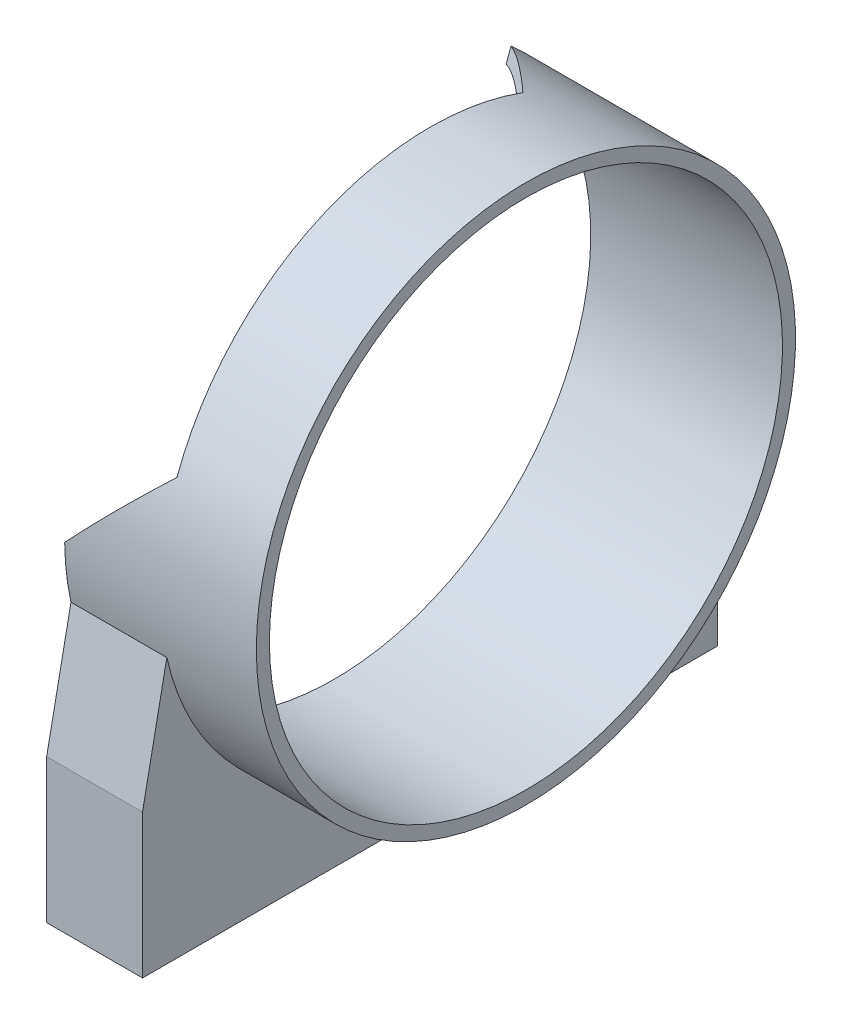
ISO-10303-21;
HEADER;
FILE_DESCRIPTION(('STEP AP214'),'2;1');
FILE_NAME('part.step','',(''),(''),'','','');
FILE_SCHEMA(('AUTOMOTIVE_DESIGN { 1 0 10303 214 1 1 1 1 }'));
ENDSEC;
DATA;
#1=APPLICATION_CONTEXT('core data for automotive mechanical design processes');
#2=APPLICATION_PROTOCOL_DEFINITION('international standard','automotive_design',2000,#1);
#3=PRODUCT_CONTEXT('',#1,'mechanical');
#4=PRODUCT('Part','Part','',(#3));
#5=PRODUCT_RELATED_PRODUCT_CATEGORY('part','',(#4));
#6=PRODUCT_DEFINITION_FORMATION('','',#4);
#7=PRODUCT_DEFINITION_CONTEXT('part definition',#1,'design');
#8=PRODUCT_DEFINITION('design','',#6,#7);
#9=PRODUCT_DEFINITION_SHAPE('','',#8);
#10=(LENGTH_UNIT() NAMED_UNIT(*) SI_UNIT(.MILLI.,.METRE.));
#11=(NAMED_UNIT(*) PLANE_ANGLE_UNIT() SI_UNIT($,.RADIAN.));
#12=(NAMED_UNIT(*) SI_UNIT($,.STERADIAN.) SOLID_ANGLE_UNIT());
#13=UNCERTAINTY_MEASURE_WITH_UNIT(LENGTH_MEASURE(1.E-05),#10,'distance_accuracy_value','');
#14=(GEOMETRIC_REPRESENTATION_CONTEXT(3) GLOBAL_UNCERTAINTY_ASSIGNED_CONTEXT((#13)) GLOBAL_UNIT_ASSIGNED_CONTEXT((#10,
#11,#12)) REPRESENTATION_CONTEXT('',''));
#15=CARTESIAN_POINT('',(0.,0.,0.));
#16=DIRECTION('',(0.,0.,1.));
#17=DIRECTION('',(1.,0.,0.));
#18=AXIS2_PLACEMENT_3D('',#15,#16,#17);
#19=CARTESIAN_POINT('',(-8.,27.,0.));
#20=DIRECTION('',(1.,0.,0.));
#21=DIRECTION('',(0.,0.,-1.));
#22=AXIS2_PLACEMENT_3D('',#19,#20,#21);
#23=CYLINDRICAL_SURFACE('',#22,21.41);
#24=CARTESIAN_POINT('',(0.,27.,0.));
#25=DIRECTION('',(-1.,0.,0.));
#26=DIRECTION('',(0.,0.,1.));
#27=AXIS2_PLACEMENT_3D('',#24,#25,#26);
#28=CIRCLE('',#27,21.41);
#29=CARTESIAN_POINT('',(0.,47.0999732918063,-7.37422359768623));
#30=VERTEX_POINT('',#29);
#31=CARTESIAN_POINT('',(0.,34.3742235976862,20.0999732918063));
#32=VERTEX_POINT('',#31);
#33=EDGE_CURVE('E123',#30,#32,#28,.F.);
#34=ORIENTED_EDGE('',*,*,#33,.F.);
#35=CARTESIAN_POINT('',(1.40512601554121E-13,27.,0.));
#36=DIRECTION('',(0.707106781186544,-0.243548038856134,-0.663840607954452));
#37=DIRECTION('',(0.707106781186551,0.243548038856131,0.663840607954445));
#38=AXIS2_PLACEMENT_3D('',#35,#36,#37);
#39=ELLIPSE('',#38,30.2783123704081,21.41);
#40=CARTESIAN_POINT('',(-8.,42.8886380272938,-14.3505847141374));
#41=VERTEX_POINT('',#40);
#42=EDGE_CURVE('E128',#30,#41,#39,.F.);
#43=ORIENTED_EDGE('',*,*,#42,.T.);
#44=CARTESIAN_POINT('',(-8.,27.,0.));
#45=DIRECTION('',(1.,0.,0.));
#46=DIRECTION('',(0.,0.,-1.));
#47=AXIS2_PLACEMENT_3D('',#44,#45,#46);
#48=CIRCLE('',#47,21.41);
#49=CARTESIAN_POINT('',(-8.,26.3295864577664,21.3995010615292));
#50=VERTEX_POINT('',#49);
#51=EDGE_CURVE('E124',#50,#41,#48,.T.);
#52=ORIENTED_EDGE('',*,*,#51,.F.);
#53=CARTESIAN_POINT('',(1.40512601554121E-13,27.,0.));
#54=DIRECTION('',(0.707106781186544,-0.663840607954452,0.243548038856134));
#55=DIRECTION('',(0.707106781186551,0.663840607954445,-0.243548038856131));
#56=AXIS2_PLACEMENT_3D('',#53,#54,#55);
#57=ELLIPSE('',#56,30.2783123704081,21.41);
#58=EDGE_CURVE('E120',#50,#32,#57,.F.);
#59=ORIENTED_EDGE('',*,*,#58,.T.);
#60=EDGE_LOOP('',(#34,#43,#52,#59));
#61=FACE_BOUND('',#60,.T.);
#62=CARTESIAN_POINT('',(8.,27.,0.));
#63=DIRECTION('',(-1.,0.,0.));
#64=DIRECTION('',(0.,0.,1.));
#65=AXIS2_PLACEMENT_3D('',#62,#63,#64);
#66=CIRCLE('',#65,21.41);
#67=CARTESIAN_POINT('',(8.,27.,21.41));
#68=VERTEX_POINT('',#67);
#69=EDGE_CURVE('E139',#68,#68,#66,.T.);
#70=ORIENTED_EDGE('',*,*,#69,.F.);
#71=EDGE_LOOP('',(#70));
#72=FACE_BOUND('',#71,.T.);
#73=ADVANCED_FACE('F36',(#61,#72),#23,.F.);
#74=CARTESIAN_POINT('',(-8.,0.,0.));
#75=DIRECTION('',(0.,1.,0.));
#76=DIRECTION('',(0.,0.,1.));
#77=AXIS2_PLACEMENT_3D('',#74,#75,#76);
#78=PLANE('',#77);
#79=CARTESIAN_POINT('',(-5.,0.,-21.));
#80=DIRECTION('',(0.,-1.,0.));
#81=DIRECTION('',(0.,0.,-1.));
#82=AXIS2_PLACEMENT_3D('',#79,#80,#81);
#83=CIRCLE('',#82,1.99999999999999);
#84=CARTESIAN_POINT('',(-5.,0.,-23.));
#85=VERTEX_POINT('',#84);
#86=EDGE_CURVE('E157',#85,#85,#83,.T.);
#87=ORIENTED_EDGE('',*,*,#86,.F.);
#88=EDGE_LOOP('',(#87));
#89=FACE_BOUND('',#88,.T.);
#90=CARTESIAN_POINT('',(-5.,0.,21.));
#91=DIRECTION('',(0.,-1.,0.));
#92=DIRECTION('',(0.,0.,-1.));
#93=AXIS2_PLACEMENT_3D('',#90,#91,#92);
#94=CIRCLE('',#93,1.99999999999999);
#95=CARTESIAN_POINT('',(-5.,0.,19.));
#96=VERTEX_POINT('',#95);
#97=EDGE_CURVE('E163',#96,#96,#94,.T.);
#98=ORIENTED_EDGE('',*,*,#97,.F.);
#99=EDGE_LOOP('',(#98));
#100=FACE_BOUND('',#99,.T.);
#101=DIRECTION('',(0.,0.,1.));
#102=VECTOR('',#101,1.);
#103=CARTESIAN_POINT('',(0.,0.,0.));
#104=LINE('',#103,#102);
#105=CARTESIAN_POINT('',(0.,0.,-24.));
#106=VERTEX_POINT('',#105);
#107=CARTESIAN_POINT('',(0.,0.,24.));
#108=VERTEX_POINT('',#107);
#109=EDGE_CURVE('E189',#106,#108,#104,.T.);
#110=ORIENTED_EDGE('',*,*,#109,.T.);
#111=DIRECTION('',(1.,0.,0.));
#112=VECTOR('',#111,1.);
#113=CARTESIAN_POINT('',(-8.,0.,24.));
#114=LINE('',#113,#112);
#115=CARTESIAN_POINT('',(-8.,0.,24.));
#116=VERTEX_POINT('',#115);
#117=EDGE_CURVE('E202',#116,#108,#114,.T.);
#118=ORIENTED_EDGE('',*,*,#117,.F.);
#119=DIRECTION('',(0.,0.,1.));
#120=VECTOR('',#119,1.);
#121=CARTESIAN_POINT('',(-8.,0.,0.));
#122=LINE('',#121,#120);
#123=CARTESIAN_POINT('',(-8.,0.,-24.));
#124=VERTEX_POINT('',#123);
#125=EDGE_CURVE('E194',#124,#116,#122,.T.);
#126=ORIENTED_EDGE('',*,*,#125,.F.);
#127=DIRECTION('',(1.,0.,0.));
#128=VECTOR('',#127,1.);
#129=CARTESIAN_POINT('',(-8.,0.,-24.));
#130=LINE('',#129,#128);
#131=EDGE_CURVE('E177',#124,#106,#130,.T.);
#132=ORIENTED_EDGE('',*,*,#131,.T.);
#133=EDGE_LOOP('',(#110,#118,#126,#132));
#134=FACE_BOUND('',#133,.T.);
#135=ADVANCED_FACE('F243',(#89,#100,#134),#78,.F.);
#136=CARTESIAN_POINT('',(-8.,0.,24.));
#137=DIRECTION('',(0.,0.,-1.));
#138=DIRECTION('',(-1.,0.,0.));
#139=AXIS2_PLACEMENT_3D('',#136,#137,#138);
#140=PLANE('',#139);
#141=DIRECTION('',(0.,1.,0.));
#142=VECTOR('',#141,1.);
#143=CARTESIAN_POINT('',(0.,0.,24.));
#144=LINE('',#143,#142);
#145=CARTESIAN_POINT('',(0.,12.,24.));
#146=VERTEX_POINT('',#145);
#147=EDGE_CURVE('E199',#108,#146,#144,.T.);
#148=ORIENTED_EDGE('',*,*,#147,.T.);
#149=DIRECTION('',(1.,0.,0.));
#150=VECTOR('',#149,1.);
#151=CARTESIAN_POINT('',(-8.,12.,24.));
#152=LINE('',#151,#150);
#153=CARTESIAN_POINT('',(-8.,12.,24.));
#154=VERTEX_POINT('',#153);
#155=EDGE_CURVE('E196',#154,#146,#152,.T.);
#156=ORIENTED_EDGE('',*,*,#155,.F.);
#157=DIRECTION('',(0.,1.,0.));
#158=VECTOR('',#157,1.);
#159=CARTESIAN_POINT('',(-8.,0.,24.));
#160=LINE('',#159,#158);
#161=EDGE_CURVE('E192',#116,#154,#160,.T.);
#162=ORIENTED_EDGE('',*,*,#161,.F.);
#163=ORIENTED_EDGE('',*,*,#117,.T.);
#164=EDGE_LOOP('',(#148,#156,#162,#163));
#165=FACE_BOUND('',#164,.T.);
#166=ADVANCED_FACE('F249',(#165),#140,.F.);
#167=CARTESIAN_POINT('',(-8.,5.07692307692308,25.3846153846154));
#168=DIRECTION('',(0.,-0.196116135138184,-0.98058067569092));
#169=DIRECTION('',(0.,0.98058067569092,-0.196116135138184));
#170=AXIS2_PLACEMENT_3D('',#167,#168,#169);
#171=PLANE('',#170);
#172=DIRECTION('',(0.,0.98058067569092,-0.196116135138184));
#173=VECTOR('',#172,1.);
#174=CARTESIAN_POINT('',(0.,5.07692307692308,25.3846153846154));
#175=LINE('',#174,#173);
#176=CARTESIAN_POINT('',(0.,22.1474798034101,21.970504039318));
#177=VERTEX_POINT('',#176);
#178=EDGE_CURVE('E184',#146,#177,#175,.T.);
#179=ORIENTED_EDGE('',*,*,#178,.T.);
#180=DIRECTION('',(-1.,0.,0.));
#181=VECTOR('',#180,1.);
#182=CARTESIAN_POINT('',(8.,22.1474798034101,21.970504039318));
#183=LINE('',#182,#181);
#184=CARTESIAN_POINT('',(-8.,22.1474798034101,21.970504039318));
#185=VERTEX_POINT('',#184);
#186=EDGE_CURVE('E155',#177,#185,#183,.T.);
#187=ORIENTED_EDGE('',*,*,#186,.T.);
#188=DIRECTION('',(0.,0.98058067569092,-0.196116135138184));
#189=VECTOR('',#188,1.);
#190=CARTESIAN_POINT('',(-8.,5.07692307692308,25.3846153846154));
#191=LINE('',#190,#189);
#192=EDGE_CURVE('E188',#154,#185,#191,.T.);
#193=ORIENTED_EDGE('',*,*,#192,.F.);
#194=ORIENTED_EDGE('',*,*,#155,.T.);
#195=EDGE_LOOP('',(#179,#187,#193,#194));
#196=FACE_BOUND('',#195,.T.);
#197=ADVANCED_FACE('F220',(#196),#171,.F.);
#198=CARTESIAN_POINT('',(-8.,0.,0.));
#199=DIRECTION('',(1.,0.,0.));
#200=DIRECTION('',(0.,0.,-1.));
#201=AXIS2_PLACEMENT_3D('',#198,#199,#200);
#202=PLANE('',#201);
#203=ORIENTED_EDGE('',*,*,#51,.T.);
#204=DIRECTION('',(0.,0.938812391023182,-0.344428939639712));
#205=VECTOR('',#204,1.);
#206=CARTESIAN_POINT('',(-8.,0.447613433338365,1.22006309355439));
#207=LINE('',#206,#205);
#208=CARTESIAN_POINT('',(-8.,43.9875497679991,-14.7537504682624));
#209=VERTEX_POINT('',#208);
#210=EDGE_CURVE('E51',#41,#209,#207,.T.);
#211=ORIENTED_EDGE('',*,*,#210,.T.);
#212=CARTESIAN_POINT('',(-8.,27.,0.));
#213=DIRECTION('',(-1.,0.,0.));
#214=DIRECTION('',(0.,0.,1.));
#215=AXIS2_PLACEMENT_3D('',#212,#213,#214);
#216=CIRCLE('',#215,22.5);
#217=CARTESIAN_POINT('',(-8.,22.1474798034101,-21.970504039318));
#218=VERTEX_POINT('',#217);
#219=EDGE_CURVE('E146',#209,#218,#216,.T.);
#220=ORIENTED_EDGE('',*,*,#219,.T.);
#221=DIRECTION('',(0.,0.98058067569092,0.196116135138184));
#222=VECTOR('',#221,1.);
#223=CARTESIAN_POINT('',(-8.,5.07692307692308,-25.3846153846154));
#224=LINE('',#223,#222);
#225=CARTESIAN_POINT('',(-8.,12.,-24.));
#226=VERTEX_POINT('',#225);
#227=EDGE_CURVE('E173',#226,#218,#224,.T.);
#228=ORIENTED_EDGE('',*,*,#227,.F.);
#229=DIRECTION('',(0.,1.,0.));
#230=VECTOR('',#229,1.);
#231=CARTESIAN_POINT('',(-8.,0.,-24.));
#232=LINE('',#231,#230);
#233=EDGE_CURVE('E170',#124,#226,#232,.T.);
#234=ORIENTED_EDGE('',*,*,#233,.F.);
#235=ORIENTED_EDGE('',*,*,#125,.T.);
#236=ORIENTED_EDGE('',*,*,#161,.T.);
#237=ORIENTED_EDGE('',*,*,#192,.T.);
#238=CARTESIAN_POINT('',(-8.,26.7327522118914,22.4984128022345));
#239=VERTEX_POINT('',#238);
#240=EDGE_CURVE('E151',#185,#239,#216,.T.);
#241=ORIENTED_EDGE('',*,*,#240,.T.);
#242=DIRECTION('',(0.,-0.344428939639712,-0.938812391023182));
#243=VECTOR('',#242,1.);
#244=CARTESIAN_POINT('',(-8.,16.2864559213584,-5.97513070462218));
#245=LINE('',#244,#243);
#246=EDGE_CURVE('E212',#239,#50,#245,.T.);
#247=ORIENTED_EDGE('',*,*,#246,.T.);
#248=EDGE_LOOP('',(#203,#211,#220,#228,#234,#235,#236,#237,#241,#247));
#249=FACE_BOUND('',#248,.T.);
#250=ADVANCED_FACE('F214',(#249),#202,.F.);
#251=CARTESIAN_POINT('',(0.,0.,0.));
#252=DIRECTION('',(1.,0.,0.));
#253=DIRECTION('',(0.,0.,-1.));
#254=AXIS2_PLACEMENT_3D('',#251,#252,#253);
#255=PLANE('',#254);
#256=CARTESIAN_POINT('',(0.,27.,0.));
#257=DIRECTION('',(1.,0.,0.));
#258=DIRECTION('',(0.,0.,-1.));
#259=AXIS2_PLACEMENT_3D('',#256,#257,#258);
#260=CIRCLE('',#259,22.5);
#261=CARTESIAN_POINT('',(0.,22.1474798034101,-21.970504039318));
#262=VERTEX_POINT('',#261);
#263=EDGE_CURVE('E150',#177,#262,#260,.T.);
#264=ORIENTED_EDGE('',*,*,#263,.F.);
#265=ORIENTED_EDGE('',*,*,#178,.F.);
#266=ORIENTED_EDGE('',*,*,#147,.F.);
#267=ORIENTED_EDGE('',*,*,#109,.F.);
#268=DIRECTION('',(0.,1.,0.));
#269=VECTOR('',#268,1.);
#270=CARTESIAN_POINT('',(0.,0.,-24.));
#271=LINE('',#270,#269);
#272=CARTESIAN_POINT('',(0.,12.,-24.));
#273=VERTEX_POINT('',#272);
#274=EDGE_CURVE('E169',#106,#273,#271,.T.);
#275=ORIENTED_EDGE('',*,*,#274,.T.);
#276=DIRECTION('',(0.,0.98058067569092,0.196116135138184));
#277=VECTOR('',#276,1.);
#278=CARTESIAN_POINT('',(0.,5.07692307692308,-25.3846153846154));
#279=LINE('',#278,#277);
#280=EDGE_CURVE('E174',#273,#262,#279,.T.);
#281=ORIENTED_EDGE('',*,*,#280,.T.);
#282=EDGE_LOOP('',(#264,#265,#266,#267,#275,#281));
#283=FACE_BOUND('',#282,.T.);
#284=ADVANCED_FACE('F225',(#283),#255,.T.);
#285=CARTESIAN_POINT('',(-8.,5.07692307692308,-25.3846153846154));
#286=DIRECTION('',(0.,0.196116135138184,-0.98058067569092));
#287=DIRECTION('',(0.,0.98058067569092,0.196116135138184));
#288=AXIS2_PLACEMENT_3D('',#285,#286,#287);
#289=PLANE('',#288);
#290=DIRECTION('',(-1.,0.,0.));
#291=VECTOR('',#290,1.);
#292=CARTESIAN_POINT('',(8.,22.1474798034101,-21.970504039318));
#293=LINE('',#292,#291);
#294=EDGE_CURVE('E205',#262,#218,#293,.T.);
#295=ORIENTED_EDGE('',*,*,#294,.F.);
#296=ORIENTED_EDGE('',*,*,#280,.F.);
#297=DIRECTION('',(1.,0.,0.));
#298=VECTOR('',#297,1.);
#299=CARTESIAN_POINT('',(-8.,12.,-24.));
#300=LINE('',#299,#298);
#301=EDGE_CURVE('E182',#226,#273,#300,.T.);
#302=ORIENTED_EDGE('',*,*,#301,.F.);
#303=ORIENTED_EDGE('',*,*,#227,.T.);
#304=EDGE_LOOP('',(#295,#296,#302,#303));
#305=FACE_BOUND('',#304,.T.);
#306=ADVANCED_FACE('F229',(#305),#289,.T.);
#307=CARTESIAN_POINT('',(-8.,0.,-24.));
#308=DIRECTION('',(0.,0.,-1.));
#309=DIRECTION('',(-1.,0.,0.));
#310=AXIS2_PLACEMENT_3D('',#307,#308,#309);
#311=PLANE('',#310);
#312=ORIENTED_EDGE('',*,*,#274,.F.);
#313=ORIENTED_EDGE('',*,*,#131,.F.);
#314=ORIENTED_EDGE('',*,*,#233,.T.);
#315=ORIENTED_EDGE('',*,*,#301,.T.);
#316=EDGE_LOOP('',(#312,#313,#314,#315));
#317=FACE_BOUND('',#316,.T.);
#318=ADVANCED_FACE('F261',(#317),#311,.T.);
#319=CARTESIAN_POINT('',(-5.,12.,21.));
#320=DIRECTION('',(0.,-1.,0.));
#321=DIRECTION('',(0.,0.,-1.));
#322=AXIS2_PLACEMENT_3D('',#319,#320,#321);
#323=CONICAL_SURFACE('',#322,2.,1.02974425867665);
#324=CARTESIAN_POINT('',(-5.,13.2017212380551,21.));
#325=VERTEX_POINT('',#324);
#326=VERTEX_LOOP('',#325);
#327=FACE_BOUND('',#326,.T.);
#328=CARTESIAN_POINT('',(-5.,12.,21.));
#329=DIRECTION('',(0.,-1.,0.));
#330=DIRECTION('',(0.,0.,-1.));
#331=AXIS2_PLACEMENT_3D('',#328,#329,#330);
#332=CIRCLE('',#331,2.);
#333=CARTESIAN_POINT('',(-5.,12.,19.));
#334=VERTEX_POINT('',#333);
#335=EDGE_CURVE('E166',#334,#334,#332,.T.);
#336=ORIENTED_EDGE('',*,*,#335,.T.);
#337=EDGE_LOOP('',(#336));
#338=FACE_BOUND('',#337,.T.);
#339=ADVANCED_FACE('F264',(#327,#338),#323,.F.);
#340=CARTESIAN_POINT('',(-5.,0.,21.));
#341=DIRECTION('',(0.,-1.,0.));
#342=DIRECTION('',(0.,0.,-1.));
#343=AXIS2_PLACEMENT_3D('',#340,#341,#342);
#344=CYLINDRICAL_SURFACE('',#343,1.99999999999999);
#345=ORIENTED_EDGE('',*,*,#335,.F.);
#346=EDGE_LOOP('',(#345));
#347=FACE_BOUND('',#346,.T.);
#348=ORIENTED_EDGE('',*,*,#97,.T.);
#349=EDGE_LOOP('',(#348));
#350=FACE_BOUND('',#349,.T.);
#351=ADVANCED_FACE('F270',(#347,#350),#344,.F.);
#352=CARTESIAN_POINT('',(-5.,12.,-21.));
#353=DIRECTION('',(0.,-1.,0.));
#354=DIRECTION('',(0.,0.,-1.));
#355=AXIS2_PLACEMENT_3D('',#352,#353,#354);
#356=CONICAL_SURFACE('',#355,2.,1.02974425867665);
#357=CARTESIAN_POINT('',(-5.,13.2017212380551,-21.));
#358=VERTEX_POINT('',#357);
#359=VERTEX_LOOP('',#358);
#360=FACE_BOUND('',#359,.T.);
#361=CARTESIAN_POINT('',(-5.,12.,-21.));
#362=DIRECTION('',(0.,-1.,0.));
#363=DIRECTION('',(0.,0.,-1.));
#364=AXIS2_PLACEMENT_3D('',#361,#362,#363);
#365=CIRCLE('',#364,2.);
#366=CARTESIAN_POINT('',(-5.,12.,-23.));
#367=VERTEX_POINT('',#366);
#368=EDGE_CURVE('E160',#367,#367,#365,.T.);
#369=ORIENTED_EDGE('',*,*,#368,.T.);
#370=EDGE_LOOP('',(#369));
#371=FACE_BOUND('',#370,.T.);
#372=ADVANCED_FACE('F274',(#360,#371),#356,.F.);
#373=CARTESIAN_POINT('',(-5.,0.,-21.));
#374=DIRECTION('',(0.,-1.,0.));
#375=DIRECTION('',(0.,0.,-1.));
#376=AXIS2_PLACEMENT_3D('',#373,#374,#375);
#377=CYLINDRICAL_SURFACE('',#376,1.99999999999999);
#378=ORIENTED_EDGE('',*,*,#368,.F.);
#379=EDGE_LOOP('',(#378));
#380=FACE_BOUND('',#379,.T.);
#381=ORIENTED_EDGE('',*,*,#86,.T.);
#382=EDGE_LOOP('',(#381));
#383=FACE_BOUND('',#382,.T.);
#384=ADVANCED_FACE('F278',(#380,#383),#377,.F.);
#385=CARTESIAN_POINT('',(8.,27.,0.));
#386=DIRECTION('',(-1.,0.,0.));
#387=DIRECTION('',(0.,0.,1.));
#388=AXIS2_PLACEMENT_3D('',#385,#386,#387);
#389=CYLINDRICAL_SURFACE('',#388,22.5);
#390=ORIENTED_EDGE('',*,*,#219,.F.);
#391=CARTESIAN_POINT('',(1.40512601554121E-13,27.,0.));
#392=DIRECTION('',(0.707106781186544,-0.243548038856134,-0.663840607954452));
#393=DIRECTION('',(-0.707106781186551,-0.243548038856131,-0.663840607954445));
#394=AXIS2_PLACEMENT_3D('',#391,#392,#393);
#395=ELLIPSE('',#394,31.8198051533948,22.5);
#396=CARTESIAN_POINT('',(0.,48.1232787980216,-7.74965114189352));
#397=VERTEX_POINT('',#396);
#398=EDGE_CURVE('E11',#209,#397,#395,.T.);
#399=ORIENTED_EDGE('',*,*,#398,.T.);
#400=CARTESIAN_POINT('',(0.,27.,0.));
#401=DIRECTION('',(-1.,0.,0.));
#402=DIRECTION('',(0.,0.,1.));
#403=AXIS2_PLACEMENT_3D('',#400,#401,#402);
#404=CIRCLE('',#403,22.5);
#405=CARTESIAN_POINT('',(0.,34.7496511418935,21.1232787980216));
#406=VERTEX_POINT('',#405);
#407=EDGE_CURVE('E129',#397,#406,#404,.F.);
#408=ORIENTED_EDGE('',*,*,#407,.T.);
#409=CARTESIAN_POINT('',(1.40512601554121E-13,27.,0.));
#410=DIRECTION('',(0.707106781186544,-0.663840607954452,0.243548038856134));
#411=DIRECTION('',(-0.707106781186551,-0.663840607954445,0.243548038856131));
#412=AXIS2_PLACEMENT_3D('',#409,#410,#411);
#413=ELLIPSE('',#412,31.8198051533948,22.5);
#414=EDGE_CURVE('E44',#406,#239,#413,.T.);
#415=ORIENTED_EDGE('',*,*,#414,.T.);
#416=ORIENTED_EDGE('',*,*,#240,.F.);
#417=ORIENTED_EDGE('',*,*,#186,.F.);
#418=ORIENTED_EDGE('',*,*,#263,.T.);
#419=ORIENTED_EDGE('',*,*,#294,.T.);
#420=EDGE_LOOP('',(#390,#399,#408,#415,#416,#417,#418,#419));
#421=FACE_BOUND('',#420,.T.);
#422=CARTESIAN_POINT('',(8.,27.,0.));
#423=DIRECTION('',(-1.,0.,0.));
#424=DIRECTION('',(0.,0.,1.));
#425=AXIS2_PLACEMENT_3D('',#422,#423,#424);
#426=CIRCLE('',#425,22.5);
#427=CARTESIAN_POINT('',(8.,27.,22.5));
#428=VERTEX_POINT('',#427);
#429=EDGE_CURVE('E147',#428,#428,#426,.T.);
#430=ORIENTED_EDGE('',*,*,#429,.T.);
#431=EDGE_LOOP('',(#430));
#432=FACE_BOUND('',#431,.T.);
#433=ADVANCED_FACE('F217',(#421,#432),#389,.T.);
#434=CARTESIAN_POINT('',(8.,27.,0.));
#435=DIRECTION('',(-1.,0.,0.));
#436=DIRECTION('',(0.,0.,1.));
#437=AXIS2_PLACEMENT_3D('',#434,#435,#436);
#438=PLANE('',#437);
#439=ORIENTED_EDGE('',*,*,#69,.T.);
#440=EDGE_LOOP('',(#439));
#441=FACE_BOUND('',#440,.T.);
#442=ORIENTED_EDGE('',*,*,#429,.F.);
#443=EDGE_LOOP('',(#442));
#444=FACE_BOUND('',#443,.T.);
#445=ADVANCED_FACE('F239',(#441,#444),#438,.F.);
#446=CARTESIAN_POINT('',(0.,0.,0.));
#447=DIRECTION('',(-1.,0.,0.));
#448=DIRECTION('',(0.,0.,1.));
#449=AXIS2_PLACEMENT_3D('',#446,#447,#448);
#450=PLANE('',#449);
#451=ORIENTED_EDGE('',*,*,#33,.T.);
#452=DIRECTION('',(0.,0.344428939639712,0.938812391023182));
#453=VECTOR('',#452,1.);
#454=CARTESIAN_POINT('',(0.,27.,0.));
#455=LINE('',#454,#453);
#456=EDGE_CURVE('E136',#32,#406,#455,.T.);
#457=ORIENTED_EDGE('',*,*,#456,.T.);
#458=ORIENTED_EDGE('',*,*,#407,.F.);
#459=DIRECTION('',(0.,-0.938812391023182,0.344428939639712));
#460=VECTOR('',#459,1.);
#461=CARTESIAN_POINT('',(0.,27.,0.));
#462=LINE('',#461,#460);
#463=EDGE_CURVE('E138',#397,#30,#462,.T.);
#464=ORIENTED_EDGE('',*,*,#463,.T.);
#465=EDGE_LOOP('',(#451,#457,#458,#464));
#466=FACE_BOUND('',#465,.T.);
#467=ADVANCED_FACE('F134',(#466),#450,.T.);
#468=CARTESIAN_POINT('',(1.40512601554121E-13,27.,0.));
#469=DIRECTION('',(0.707106781186544,-0.243548038856134,-0.663840607954452));
#470=DIRECTION('',(0.,-0.938812391023182,0.344428939639712));
#471=AXIS2_PLACEMENT_3D('',#468,#469,#470);
#472=PLANE('',#471);
#473=ORIENTED_EDGE('',*,*,#398,.F.);
#474=ORIENTED_EDGE('',*,*,#210,.F.);
#475=ORIENTED_EDGE('',*,*,#42,.F.);
#476=ORIENTED_EDGE('',*,*,#463,.F.);
#477=EDGE_LOOP('',(#473,#474,#475,#476));
#478=FACE_BOUND('',#477,.T.);
#479=ADVANCED_FACE('F233',(#478),#472,.F.);
#480=CARTESIAN_POINT('',(1.40512601554121E-13,27.,0.));
#481=DIRECTION('',(0.707106781186544,-0.663840607954452,0.243548038856134));
#482=DIRECTION('',(0.,0.344428939639712,0.938812391023182));
#483=AXIS2_PLACEMENT_3D('',#480,#481,#482);
#484=PLANE('',#483);
#485=ORIENTED_EDGE('',*,*,#58,.F.);
#486=ORIENTED_EDGE('',*,*,#246,.F.);
#487=ORIENTED_EDGE('',*,*,#414,.F.);
#488=ORIENTED_EDGE('',*,*,#456,.F.);
#489=EDGE_LOOP('',(#485,#486,#487,#488));
#490=FACE_BOUND('',#489,.T.);
#491=ADVANCED_FACE('F38',(#490),#484,.F.);
#492=CLOSED_SHELL('',(#73,#135,#166,#197,#250,#284,#306,#318,#339,#351,#372,#384,#433,#445,#467,
#479,#491));
#493=MANIFOLD_SOLID_BREP('B2',#492);
#494=ADVANCED_BREP_SHAPE_REPRESENTATION('',(#18,#493),#14);
#495=SHAPE_DEFINITION_REPRESENTATION(#9,#494);
ENDSEC;
END-ISO-10303-21;
